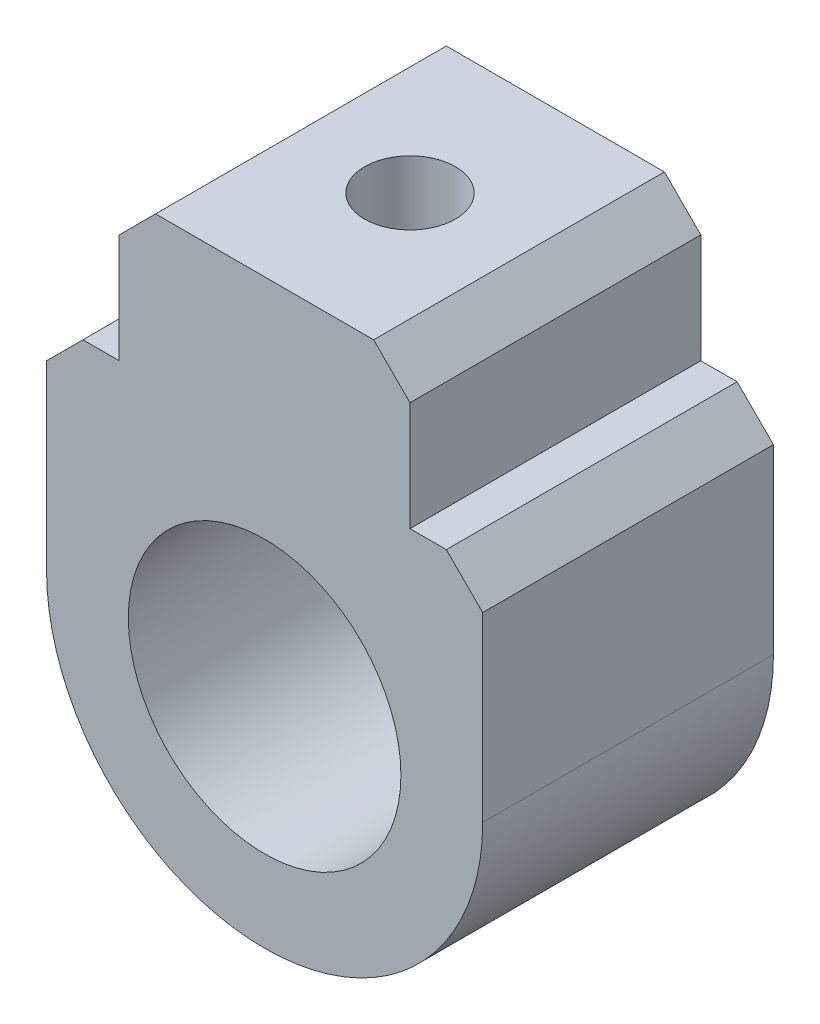
ISO-10303-21;
HEADER;
FILE_DESCRIPTION(('STEP AP214'),'2;1');
FILE_NAME('part.step','',(''),(''),'','','');
FILE_SCHEMA(('AUTOMOTIVE_DESIGN { 1 0 10303 214 1 1 1 1 }'));
ENDSEC;
DATA;
#1=APPLICATION_CONTEXT('core data for automotive mechanical design processes');
#2=APPLICATION_PROTOCOL_DEFINITION('international standard','automotive_design',2000,#1);
#3=PRODUCT_CONTEXT('',#1,'mechanical');
#4=PRODUCT('Part','Part','',(#3));
#5=PRODUCT_RELATED_PRODUCT_CATEGORY('part','',(#4));
#6=PRODUCT_DEFINITION_FORMATION('','',#4);
#7=PRODUCT_DEFINITION_CONTEXT('part definition',#1,'design');
#8=PRODUCT_DEFINITION('design','',#6,#7);
#9=PRODUCT_DEFINITION_SHAPE('','',#8);
#10=(LENGTH_UNIT() NAMED_UNIT(*) SI_UNIT(.MILLI.,.METRE.));
#11=(NAMED_UNIT(*) PLANE_ANGLE_UNIT() SI_UNIT($,.RADIAN.));
#12=(NAMED_UNIT(*) SI_UNIT($,.STERADIAN.) SOLID_ANGLE_UNIT());
#13=UNCERTAINTY_MEASURE_WITH_UNIT(LENGTH_MEASURE(1.E-05),#10,'distance_accuracy_value','');
#14=(GEOMETRIC_REPRESENTATION_CONTEXT(3) GLOBAL_UNCERTAINTY_ASSIGNED_CONTEXT((#13)) GLOBAL_UNIT_ASSIGNED_CONTEXT((#10,
#11,#12)) REPRESENTATION_CONTEXT('',''));
#15=CARTESIAN_POINT('',(0.,0.,0.));
#16=DIRECTION('',(0.,0.,1.));
#17=DIRECTION('',(1.,0.,0.));
#18=AXIS2_PLACEMENT_3D('',#15,#16,#17);
#19=CARTESIAN_POINT('',(0.,0.,8.));
#20=DIRECTION('',(0.,0.,1.));
#21=DIRECTION('',(1.,0.,0.));
#22=AXIS2_PLACEMENT_3D('',#19,#20,#21);
#23=PLANE('',#22);
#24=DIRECTION('',(-1.,0.,0.));
#25=VECTOR('',#24,1.);
#26=CARTESIAN_POINT('',(-4.,9.99999999999999,8.));
#27=LINE('',#26,#25);
#28=CARTESIAN_POINT('',(3.,9.99999999999999,8.));
#29=VERTEX_POINT('',#28);
#30=CARTESIAN_POINT('',(-3.,9.99999999999999,8.));
#31=VERTEX_POINT('',#30);
#32=EDGE_CURVE('E224',#29,#31,#27,.T.);
#33=ORIENTED_EDGE('',*,*,#32,.T.);
#34=DIRECTION('',(0.707106781186548,0.707106781186547,0.));
#35=VECTOR('',#34,1.);
#36=CARTESIAN_POINT('',(-6.49999999999999,6.50000000000001,8.));
#37=LINE('',#36,#35);
#38=CARTESIAN_POINT('',(-4.,8.99999999999999,8.));
#39=VERTEX_POINT('',#38);
#40=EDGE_CURVE('E175',#31,#39,#37,.F.);
#41=ORIENTED_EDGE('',*,*,#40,.T.);
#42=DIRECTION('',(0.,-1.,0.));
#43=VECTOR('',#42,1.);
#44=CARTESIAN_POINT('',(-4.,5.99999999999999,8.));
#45=LINE('',#44,#43);
#46=CARTESIAN_POINT('',(-4.,5.99999999999999,8.));
#47=VERTEX_POINT('',#46);
#48=EDGE_CURVE('E222',#39,#47,#45,.T.);
#49=ORIENTED_EDGE('',*,*,#48,.T.);
#50=DIRECTION('',(-1.,0.,0.));
#51=VECTOR('',#50,1.);
#52=CARTESIAN_POINT('',(-6.,5.99999999999999,8.));
#53=LINE('',#52,#51);
#54=CARTESIAN_POINT('',(-5.,5.99999999999999,8.));
#55=VERTEX_POINT('',#54);
#56=EDGE_CURVE('E203',#47,#55,#53,.T.);
#57=ORIENTED_EDGE('',*,*,#56,.T.);
#58=DIRECTION('',(0.707106781186548,0.707106781186547,0.));
#59=VECTOR('',#58,1.);
#60=CARTESIAN_POINT('',(-5.49999999999999,5.5,8.));
#61=LINE('',#60,#59);
#62=CARTESIAN_POINT('',(-6.,4.99999999999999,8.));
#63=VERTEX_POINT('',#62);
#64=EDGE_CURVE('E48',#55,#63,#61,.F.);
#65=ORIENTED_EDGE('',*,*,#64,.T.);
#66=DIRECTION('',(0.,-1.,0.));
#67=VECTOR('',#66,1.);
#68=CARTESIAN_POINT('',(-6.,0.,8.));
#69=LINE('',#68,#67);
#70=CARTESIAN_POINT('',(-6.,0.,8.));
#71=VERTEX_POINT('',#70);
#72=EDGE_CURVE('E138',#63,#71,#69,.T.);
#73=ORIENTED_EDGE('',*,*,#72,.T.);
#74=CARTESIAN_POINT('',(0.,0.,8.));
#75=DIRECTION('',(0.,0.,1.));
#76=DIRECTION('',(1.,0.,0.));
#77=AXIS2_PLACEMENT_3D('',#74,#75,#76);
#78=CIRCLE('',#77,6.);
#79=CARTESIAN_POINT('',(6.,0.,8.));
#80=VERTEX_POINT('',#79);
#81=EDGE_CURVE('E133',#71,#80,#78,.T.);
#82=ORIENTED_EDGE('',*,*,#81,.T.);
#83=DIRECTION('',(0.,1.,0.));
#84=VECTOR('',#83,1.);
#85=CARTESIAN_POINT('',(6.,0.,8.));
#86=LINE('',#85,#84);
#87=CARTESIAN_POINT('',(6.,5.00000000000001,8.));
#88=VERTEX_POINT('',#87);
#89=EDGE_CURVE('E122',#80,#88,#86,.T.);
#90=ORIENTED_EDGE('',*,*,#89,.T.);
#91=DIRECTION('',(0.707106781186547,-0.707106781186548,0.));
#92=VECTOR('',#91,1.);
#93=CARTESIAN_POINT('',(5.50000000000001,5.5,8.));
#94=LINE('',#93,#92);
#95=CARTESIAN_POINT('',(5.,6.00000000000001,8.));
#96=VERTEX_POINT('',#95);
#97=EDGE_CURVE('E171',#88,#96,#94,.F.);
#98=ORIENTED_EDGE('',*,*,#97,.T.);
#99=DIRECTION('',(-1.,0.,0.));
#100=VECTOR('',#99,1.);
#101=CARTESIAN_POINT('',(4.,6.00000000000001,8.));
#102=LINE('',#101,#100);
#103=CARTESIAN_POINT('',(4.,6.00000000000001,8.));
#104=VERTEX_POINT('',#103);
#105=EDGE_CURVE('E132',#96,#104,#102,.T.);
#106=ORIENTED_EDGE('',*,*,#105,.T.);
#107=DIRECTION('',(0.,1.,0.));
#108=VECTOR('',#107,1.);
#109=CARTESIAN_POINT('',(4.,9.99999999999999,8.));
#110=LINE('',#109,#108);
#111=CARTESIAN_POINT('',(4.,8.99999999999998,8.));
#112=VERTEX_POINT('',#111);
#113=EDGE_CURVE('E226',#104,#112,#110,.T.);
#114=ORIENTED_EDGE('',*,*,#113,.T.);
#115=DIRECTION('',(0.707106781186546,-0.707106781186549,0.));
#116=VECTOR('',#115,1.);
#117=CARTESIAN_POINT('',(6.5,6.49999999999997,8.));
#118=LINE('',#117,#116);
#119=EDGE_CURVE('E173',#112,#29,#118,.F.);
#120=ORIENTED_EDGE('',*,*,#119,.T.);
#121=EDGE_LOOP('',(#33,#41,#49,#57,#65,#73,#82,#90,#98,#106,#114,#120));
#122=FACE_BOUND('',#121,.T.);
#123=CARTESIAN_POINT('',(0.,0.,8.));
#124=DIRECTION('',(0.,0.,1.));
#125=DIRECTION('',(1.,0.,0.));
#126=AXIS2_PLACEMENT_3D('',#123,#124,#125);
#127=CIRCLE('',#126,3.75);
#128=CARTESIAN_POINT('',(3.75,0.,8.));
#129=VERTEX_POINT('',#128);
#130=EDGE_CURVE('E219',#129,#129,#127,.T.);
#131=ORIENTED_EDGE('',*,*,#130,.F.);
#132=EDGE_LOOP('',(#131));
#133=FACE_BOUND('',#132,.T.);
#134=ADVANCED_FACE('F33',(#122,#133),#23,.T.);
#135=CARTESIAN_POINT('',(0.,0.,0.));
#136=DIRECTION('',(0.,0.,1.));
#137=DIRECTION('',(1.,0.,0.));
#138=AXIS2_PLACEMENT_3D('',#135,#136,#137);
#139=PLANE('',#138);
#140=DIRECTION('',(0.,-1.,0.));
#141=VECTOR('',#140,1.);
#142=CARTESIAN_POINT('',(-4.,5.99999999999999,0.));
#143=LINE('',#142,#141);
#144=CARTESIAN_POINT('',(-4.,8.99999999999999,0.));
#145=VERTEX_POINT('',#144);
#146=CARTESIAN_POINT('',(-4.,5.99999999999999,0.));
#147=VERTEX_POINT('',#146);
#148=EDGE_CURVE('E195',#145,#147,#143,.T.);
#149=ORIENTED_EDGE('',*,*,#148,.F.);
#150=DIRECTION('',(-0.707106781186548,-0.707106781186547,0.));
#151=VECTOR('',#150,1.);
#152=CARTESIAN_POINT('',(-4.,8.99999999999999,0.));
#153=LINE('',#152,#151);
#154=CARTESIAN_POINT('',(-3.,9.99999999999999,0.));
#155=VERTEX_POINT('',#154);
#156=EDGE_CURVE('E163',#145,#155,#153,.F.);
#157=ORIENTED_EDGE('',*,*,#156,.T.);
#158=DIRECTION('',(-1.,0.,0.));
#159=VECTOR('',#158,1.);
#160=CARTESIAN_POINT('',(-4.,9.99999999999999,0.));
#161=LINE('',#160,#159);
#162=CARTESIAN_POINT('',(3.,9.99999999999999,0.));
#163=VERTEX_POINT('',#162);
#164=EDGE_CURVE('E208',#163,#155,#161,.T.);
#165=ORIENTED_EDGE('',*,*,#164,.F.);
#166=DIRECTION('',(-0.707106781186546,0.707106781186549,0.));
#167=VECTOR('',#166,1.);
#168=CARTESIAN_POINT('',(3.,9.99999999999999,0.));
#169=LINE('',#168,#167);
#170=CARTESIAN_POINT('',(4.,8.99999999999999,0.));
#171=VERTEX_POINT('',#170);
#172=EDGE_CURVE('E161',#163,#171,#169,.F.);
#173=ORIENTED_EDGE('',*,*,#172,.T.);
#174=DIRECTION('',(0.,1.,0.));
#175=VECTOR('',#174,1.);
#176=CARTESIAN_POINT('',(4.,9.99999999999999,0.));
#177=LINE('',#176,#175);
#178=CARTESIAN_POINT('',(4.,6.00000000000001,0.));
#179=VERTEX_POINT('',#178);
#180=EDGE_CURVE('E209',#179,#171,#177,.T.);
#181=ORIENTED_EDGE('',*,*,#180,.F.);
#182=DIRECTION('',(-1.,0.,0.));
#183=VECTOR('',#182,1.);
#184=CARTESIAN_POINT('',(4.,6.00000000000001,0.));
#185=LINE('',#184,#183);
#186=CARTESIAN_POINT('',(5.,6.00000000000001,0.));
#187=VERTEX_POINT('',#186);
#188=EDGE_CURVE('E214',#187,#179,#185,.T.);
#189=ORIENTED_EDGE('',*,*,#188,.F.);
#190=DIRECTION('',(-0.707106781186547,0.707106781186548,0.));
#191=VECTOR('',#190,1.);
#192=CARTESIAN_POINT('',(5.,6.00000000000001,0.));
#193=LINE('',#192,#191);
#194=CARTESIAN_POINT('',(6.,5.00000000000001,0.));
#195=VERTEX_POINT('',#194);
#196=EDGE_CURVE('E159',#187,#195,#193,.F.);
#197=ORIENTED_EDGE('',*,*,#196,.T.);
#198=DIRECTION('',(0.,1.,0.));
#199=VECTOR('',#198,1.);
#200=CARTESIAN_POINT('',(6.,0.,0.));
#201=LINE('',#200,#199);
#202=CARTESIAN_POINT('',(6.,0.,0.));
#203=VERTEX_POINT('',#202);
#204=EDGE_CURVE('E216',#203,#195,#201,.T.);
#205=ORIENTED_EDGE('',*,*,#204,.F.);
#206=CARTESIAN_POINT('',(0.,0.,0.));
#207=DIRECTION('',(0.,0.,1.));
#208=DIRECTION('',(1.,0.,0.));
#209=AXIS2_PLACEMENT_3D('',#206,#207,#208);
#210=CIRCLE('',#209,6.);
#211=CARTESIAN_POINT('',(-6.,0.,0.));
#212=VERTEX_POINT('',#211);
#213=EDGE_CURVE('E146',#212,#203,#210,.T.);
#214=ORIENTED_EDGE('',*,*,#213,.F.);
#215=DIRECTION('',(0.,-1.,0.));
#216=VECTOR('',#215,1.);
#217=CARTESIAN_POINT('',(-6.,0.,0.));
#218=LINE('',#217,#216);
#219=CARTESIAN_POINT('',(-6.,4.99999999999999,0.));
#220=VERTEX_POINT('',#219);
#221=EDGE_CURVE('E142',#220,#212,#218,.T.);
#222=ORIENTED_EDGE('',*,*,#221,.F.);
#223=DIRECTION('',(-0.707106781186548,-0.707106781186547,0.));
#224=VECTOR('',#223,1.);
#225=CARTESIAN_POINT('',(-6.,4.99999999999999,0.));
#226=LINE('',#225,#224);
#227=CARTESIAN_POINT('',(-5.,5.99999999999999,0.));
#228=VERTEX_POINT('',#227);
#229=EDGE_CURVE('E151',#220,#228,#226,.F.);
#230=ORIENTED_EDGE('',*,*,#229,.T.);
#231=DIRECTION('',(-1.,0.,0.));
#232=VECTOR('',#231,1.);
#233=CARTESIAN_POINT('',(-6.,5.99999999999999,0.));
#234=LINE('',#233,#232);
#235=EDGE_CURVE('E193',#147,#228,#234,.T.);
#236=ORIENTED_EDGE('',*,*,#235,.F.);
#237=EDGE_LOOP('',(#149,#157,#165,#173,#181,#189,#197,#205,#214,#222,#230,#236));
#238=FACE_BOUND('',#237,.T.);
#239=CARTESIAN_POINT('',(0.,0.,0.));
#240=DIRECTION('',(0.,0.,1.));
#241=DIRECTION('',(1.,0.,0.));
#242=AXIS2_PLACEMENT_3D('',#239,#240,#241);
#243=CIRCLE('',#242,3.75);
#244=CARTESIAN_POINT('',(3.75,0.,0.));
#245=VERTEX_POINT('',#244);
#246=EDGE_CURVE('E230',#245,#245,#243,.T.);
#247=ORIENTED_EDGE('',*,*,#246,.T.);
#248=EDGE_LOOP('',(#247));
#249=FACE_BOUND('',#248,.T.);
#250=ADVANCED_FACE('F190',(#238,#249),#139,.F.);
#251=CARTESIAN_POINT('',(0.,0.,8.));
#252=DIRECTION('',(0.,0.,-1.));
#253=DIRECTION('',(-1.,0.,0.));
#254=AXIS2_PLACEMENT_3D('',#251,#252,#253);
#255=CYLINDRICAL_SURFACE('',#254,6.);
#256=ORIENTED_EDGE('',*,*,#213,.T.);
#257=DIRECTION('',(0.,0.,-1.));
#258=VECTOR('',#257,1.);
#259=CARTESIAN_POINT('',(6.,0.,8.));
#260=LINE('',#259,#258);
#261=EDGE_CURVE('E127',#80,#203,#260,.T.);
#262=ORIENTED_EDGE('',*,*,#261,.F.);
#263=ORIENTED_EDGE('',*,*,#81,.F.);
#264=DIRECTION('',(0.,0.,-1.));
#265=VECTOR('',#264,1.);
#266=CARTESIAN_POINT('',(-6.,0.,8.));
#267=LINE('',#266,#265);
#268=EDGE_CURVE('E199',#71,#212,#267,.T.);
#269=ORIENTED_EDGE('',*,*,#268,.T.);
#270=EDGE_LOOP('',(#256,#262,#263,#269));
#271=FACE_BOUND('',#270,.T.);
#272=ADVANCED_FACE('F144',(#271),#255,.T.);
#273=CARTESIAN_POINT('',(6.,0.,8.));
#274=DIRECTION('',(-1.,0.,0.));
#275=DIRECTION('',(0.,0.,1.));
#276=AXIS2_PLACEMENT_3D('',#273,#274,#275);
#277=PLANE('',#276);
#278=ORIENTED_EDGE('',*,*,#204,.T.);
#279=DIRECTION('',(0.,0.,1.));
#280=VECTOR('',#279,1.);
#281=CARTESIAN_POINT('',(6.,5.00000000000001,8.));
#282=LINE('',#281,#280);
#283=EDGE_CURVE('E130',#195,#88,#282,.T.);
#284=ORIENTED_EDGE('',*,*,#283,.T.);
#285=ORIENTED_EDGE('',*,*,#89,.F.);
#286=ORIENTED_EDGE('',*,*,#261,.T.);
#287=EDGE_LOOP('',(#278,#284,#285,#286));
#288=FACE_BOUND('',#287,.T.);
#289=ADVANCED_FACE('F125',(#288),#277,.F.);
#290=CARTESIAN_POINT('',(4.,6.00000000000001,8.));
#291=DIRECTION('',(0.,-1.,0.));
#292=DIRECTION('',(1.,0.,0.));
#293=AXIS2_PLACEMENT_3D('',#290,#291,#292);
#294=PLANE('',#293);
#295=ORIENTED_EDGE('',*,*,#105,.F.);
#296=DIRECTION('',(0.,0.,-1.));
#297=VECTOR('',#296,1.);
#298=CARTESIAN_POINT('',(5.,6.00000000000001,8.));
#299=LINE('',#298,#297);
#300=EDGE_CURVE('E179',#96,#187,#299,.T.);
#301=ORIENTED_EDGE('',*,*,#300,.T.);
#302=ORIENTED_EDGE('',*,*,#188,.T.);
#303=DIRECTION('',(0.,0.,-1.));
#304=VECTOR('',#303,1.);
#305=CARTESIAN_POINT('',(4.,6.00000000000001,8.));
#306=LINE('',#305,#304);
#307=EDGE_CURVE('E148',#104,#179,#306,.T.);
#308=ORIENTED_EDGE('',*,*,#307,.F.);
#309=EDGE_LOOP('',(#295,#301,#302,#308));
#310=FACE_BOUND('',#309,.T.);
#311=ADVANCED_FACE('F365',(#310),#294,.F.);
#312=CARTESIAN_POINT('',(4.,9.99999999999999,8.));
#313=DIRECTION('',(-1.,0.,0.));
#314=DIRECTION('',(0.,-1.,0.));
#315=AXIS2_PLACEMENT_3D('',#312,#313,#314);
#316=PLANE('',#315);
#317=ORIENTED_EDGE('',*,*,#180,.T.);
#318=DIRECTION('',(0.,0.,1.));
#319=VECTOR('',#318,1.);
#320=CARTESIAN_POINT('',(4.,8.99999999999999,8.));
#321=LINE('',#320,#319);
#322=EDGE_CURVE('E177',#171,#112,#321,.T.);
#323=ORIENTED_EDGE('',*,*,#322,.T.);
#324=ORIENTED_EDGE('',*,*,#113,.F.);
#325=ORIENTED_EDGE('',*,*,#307,.T.);
#326=EDGE_LOOP('',(#317,#323,#324,#325));
#327=FACE_BOUND('',#326,.T.);
#328=ADVANCED_FACE('F255',(#327),#316,.F.);
#329=CARTESIAN_POINT('',(-4.,9.99999999999999,8.));
#330=DIRECTION('',(0.,-1.,0.));
#331=DIRECTION('',(0.,0.,-1.));
#332=AXIS2_PLACEMENT_3D('',#329,#330,#331);
#333=PLANE('',#332);
#334=CARTESIAN_POINT('',(0.,9.99999999999999,4.));
#335=DIRECTION('',(0.,1.,0.));
#336=DIRECTION('',(0.,0.,1.));
#337=AXIS2_PLACEMENT_3D('',#334,#335,#336);
#338=CIRCLE('',#337,1.25);
#339=CARTESIAN_POINT('',(0.,9.99999999999999,5.25));
#340=VERTEX_POINT('',#339);
#341=EDGE_CURVE('E236',#340,#340,#338,.T.);
#342=ORIENTED_EDGE('',*,*,#341,.F.);
#343=EDGE_LOOP('',(#342));
#344=FACE_BOUND('',#343,.T.);
#345=ORIENTED_EDGE('',*,*,#164,.T.);
#346=DIRECTION('',(0.,0.,1.));
#347=VECTOR('',#346,1.);
#348=CARTESIAN_POINT('',(-3.,9.99999999999999,8.));
#349=LINE('',#348,#347);
#350=EDGE_CURVE('E168',#155,#31,#349,.T.);
#351=ORIENTED_EDGE('',*,*,#350,.T.);
#352=ORIENTED_EDGE('',*,*,#32,.F.);
#353=DIRECTION('',(0.,0.,-1.));
#354=VECTOR('',#353,1.);
#355=CARTESIAN_POINT('',(3.,9.99999999999999,8.));
#356=LINE('',#355,#354);
#357=EDGE_CURVE('E165',#29,#163,#356,.T.);
#358=ORIENTED_EDGE('',*,*,#357,.T.);
#359=EDGE_LOOP('',(#345,#351,#352,#358));
#360=FACE_BOUND('',#359,.T.);
#361=ADVANCED_FACE('F251',(#344,#360),#333,.F.);
#362=CARTESIAN_POINT('',(-4.,5.99999999999999,8.));
#363=DIRECTION('',(1.,0.,0.));
#364=DIRECTION('',(0.,1.,0.));
#365=AXIS2_PLACEMENT_3D('',#362,#363,#364);
#366=PLANE('',#365);
#367=ORIENTED_EDGE('',*,*,#48,.F.);
#368=DIRECTION('',(0.,0.,-1.));
#369=VECTOR('',#368,1.);
#370=CARTESIAN_POINT('',(-4.,8.99999999999999,8.));
#371=LINE('',#370,#369);
#372=EDGE_CURVE('E147',#39,#145,#371,.T.);
#373=ORIENTED_EDGE('',*,*,#372,.T.);
#374=ORIENTED_EDGE('',*,*,#148,.T.);
#375=DIRECTION('',(0.,0.,-1.));
#376=VECTOR('',#375,1.);
#377=CARTESIAN_POINT('',(-4.,5.99999999999999,8.));
#378=LINE('',#377,#376);
#379=EDGE_CURVE('E154',#47,#147,#378,.T.);
#380=ORIENTED_EDGE('',*,*,#379,.F.);
#381=EDGE_LOOP('',(#367,#373,#374,#380));
#382=FACE_BOUND('',#381,.T.);
#383=ADVANCED_FACE('F254',(#382),#366,.F.);
#384=CARTESIAN_POINT('',(-6.,5.99999999999999,8.));
#385=DIRECTION('',(0.,-1.,0.));
#386=DIRECTION('',(1.,0.,0.));
#387=AXIS2_PLACEMENT_3D('',#384,#385,#386);
#388=PLANE('',#387);
#389=ORIENTED_EDGE('',*,*,#235,.T.);
#390=DIRECTION('',(0.,0.,1.));
#391=VECTOR('',#390,1.);
#392=CARTESIAN_POINT('',(-5.,5.99999999999999,8.));
#393=LINE('',#392,#391);
#394=EDGE_CURVE('E11',#228,#55,#393,.T.);
#395=ORIENTED_EDGE('',*,*,#394,.T.);
#396=ORIENTED_EDGE('',*,*,#56,.F.);
#397=ORIENTED_EDGE('',*,*,#379,.T.);
#398=EDGE_LOOP('',(#389,#395,#396,#397));
#399=FACE_BOUND('',#398,.T.);
#400=ADVANCED_FACE('F202',(#399),#388,.F.);
#401=CARTESIAN_POINT('',(-6.,0.,8.));
#402=DIRECTION('',(1.,0.,0.));
#403=DIRECTION('',(0.,0.,-1.));
#404=AXIS2_PLACEMENT_3D('',#401,#402,#403);
#405=PLANE('',#404);
#406=ORIENTED_EDGE('',*,*,#72,.F.);
#407=DIRECTION('',(0.,0.,-1.));
#408=VECTOR('',#407,1.);
#409=CARTESIAN_POINT('',(-6.,4.99999999999999,8.));
#410=LINE('',#409,#408);
#411=EDGE_CURVE('E41',#63,#220,#410,.T.);
#412=ORIENTED_EDGE('',*,*,#411,.T.);
#413=ORIENTED_EDGE('',*,*,#221,.T.);
#414=ORIENTED_EDGE('',*,*,#268,.F.);
#415=EDGE_LOOP('',(#406,#412,#413,#414));
#416=FACE_BOUND('',#415,.T.);
#417=ADVANCED_FACE('F186',(#416),#405,.F.);
#418=CARTESIAN_POINT('',(0.,0.,8.));
#419=DIRECTION('',(0.,0.,-1.));
#420=DIRECTION('',(-1.,0.,0.));
#421=AXIS2_PLACEMENT_3D('',#418,#419,#420);
#422=CYLINDRICAL_SURFACE('',#421,3.75);
#423=ORIENTED_EDGE('',*,*,#130,.T.);
#424=EDGE_LOOP('',(#423));
#425=FACE_BOUND('',#424,.T.);
#426=ORIENTED_EDGE('',*,*,#246,.F.);
#427=EDGE_LOOP('',(#426));
#428=FACE_BOUND('',#427,.T.);
#429=ADVANCED_FACE('F247',(#425,#428),#422,.F.);
#430=CARTESIAN_POINT('',(0.,4.99999999999999,4.));
#431=DIRECTION('',(0.,1.,0.));
#432=DIRECTION('',(0.,0.,1.));
#433=AXIS2_PLACEMENT_3D('',#430,#431,#432);
#434=CYLINDRICAL_SURFACE('',#433,1.25);
#435=CARTESIAN_POINT('',(0.,4.99999999999999,4.));
#436=DIRECTION('',(0.,1.,0.));
#437=DIRECTION('',(0.,0.,1.));
#438=AXIS2_PLACEMENT_3D('',#435,#436,#437);
#439=CIRCLE('',#438,1.25);
#440=CARTESIAN_POINT('',(0.,4.99999999999999,5.25));
#441=VERTEX_POINT('',#440);
#442=EDGE_CURVE('E233',#441,#441,#439,.T.);
#443=ORIENTED_EDGE('',*,*,#442,.F.);
#444=EDGE_LOOP('',(#443));
#445=FACE_BOUND('',#444,.T.);
#446=ORIENTED_EDGE('',*,*,#341,.T.);
#447=EDGE_LOOP('',(#446));
#448=FACE_BOUND('',#447,.T.);
#449=ADVANCED_FACE('F244',(#445,#448),#434,.F.);
#450=CARTESIAN_POINT('',(0.,4.99999999999999,4.));
#451=DIRECTION('',(0.,1.,0.));
#452=DIRECTION('',(0.,0.,1.));
#453=AXIS2_PLACEMENT_3D('',#450,#451,#452);
#454=PLANE('',#453);
#455=ORIENTED_EDGE('',*,*,#442,.T.);
#456=EDGE_LOOP('',(#455));
#457=FACE_BOUND('',#456,.T.);
#458=ADVANCED_FACE('F242',(#457),#454,.T.);
#459=CARTESIAN_POINT('',(-4.,8.99999999999999,8.));
#460=DIRECTION('',(0.707106781186547,-0.707106781186548,0.));
#461=DIRECTION('',(0.707106781186548,0.707106781186547,0.));
#462=AXIS2_PLACEMENT_3D('',#459,#460,#461);
#463=PLANE('',#462);
#464=ORIENTED_EDGE('',*,*,#40,.F.);
#465=ORIENTED_EDGE('',*,*,#350,.F.);
#466=ORIENTED_EDGE('',*,*,#156,.F.);
#467=ORIENTED_EDGE('',*,*,#372,.F.);
#468=EDGE_LOOP('',(#464,#465,#466,#467));
#469=FACE_BOUND('',#468,.T.);
#470=ADVANCED_FACE('F262',(#469),#463,.F.);
#471=CARTESIAN_POINT('',(3.,9.99999999999999,8.));
#472=DIRECTION('',(-0.707106781186549,-0.707106781186546,0.));
#473=DIRECTION('',(0.707106781186546,-0.707106781186549,0.));
#474=AXIS2_PLACEMENT_3D('',#471,#472,#473);
#475=PLANE('',#474);
#476=ORIENTED_EDGE('',*,*,#119,.F.);
#477=ORIENTED_EDGE('',*,*,#322,.F.);
#478=ORIENTED_EDGE('',*,*,#172,.F.);
#479=ORIENTED_EDGE('',*,*,#357,.F.);
#480=EDGE_LOOP('',(#476,#477,#478,#479));
#481=FACE_BOUND('',#480,.T.);
#482=ADVANCED_FACE('F305',(#481),#475,.F.);
#483=CARTESIAN_POINT('',(5.,6.00000000000001,8.));
#484=DIRECTION('',(-0.707106781186548,-0.707106781186547,0.));
#485=DIRECTION('',(0.707106781186547,-0.707106781186548,0.));
#486=AXIS2_PLACEMENT_3D('',#483,#484,#485);
#487=PLANE('',#486);
#488=ORIENTED_EDGE('',*,*,#97,.F.);
#489=ORIENTED_EDGE('',*,*,#283,.F.);
#490=ORIENTED_EDGE('',*,*,#196,.F.);
#491=ORIENTED_EDGE('',*,*,#300,.F.);
#492=EDGE_LOOP('',(#488,#489,#490,#491));
#493=FACE_BOUND('',#492,.T.);
#494=ADVANCED_FACE('F312',(#493),#487,.F.);
#495=CARTESIAN_POINT('',(-6.,4.99999999999999,8.));
#496=DIRECTION('',(0.707106781186547,-0.707106781186548,0.));
#497=DIRECTION('',(0.707106781186548,0.707106781186547,0.));
#498=AXIS2_PLACEMENT_3D('',#495,#496,#497);
#499=PLANE('',#498);
#500=ORIENTED_EDGE('',*,*,#64,.F.);
#501=ORIENTED_EDGE('',*,*,#394,.F.);
#502=ORIENTED_EDGE('',*,*,#229,.F.);
#503=ORIENTED_EDGE('',*,*,#411,.F.);
#504=EDGE_LOOP('',(#500,#501,#502,#503));
#505=FACE_BOUND('',#504,.T.);
#506=ADVANCED_FACE('F35',(#505),#499,.F.);
#507=CLOSED_SHELL('',(#134,#250,#272,#289,#311,#328,#361,#383,#400,#417,#429,#449,#458,#470,
#482,#494,#506));
#508=MANIFOLD_SOLID_BREP('B2',#507);
#509=ADVANCED_BREP_SHAPE_REPRESENTATION('',(#18,#508),#14);
#510=SHAPE_DEFINITION_REPRESENTATION(#9,#509);
ENDSEC;
END-ISO-10303-21;
